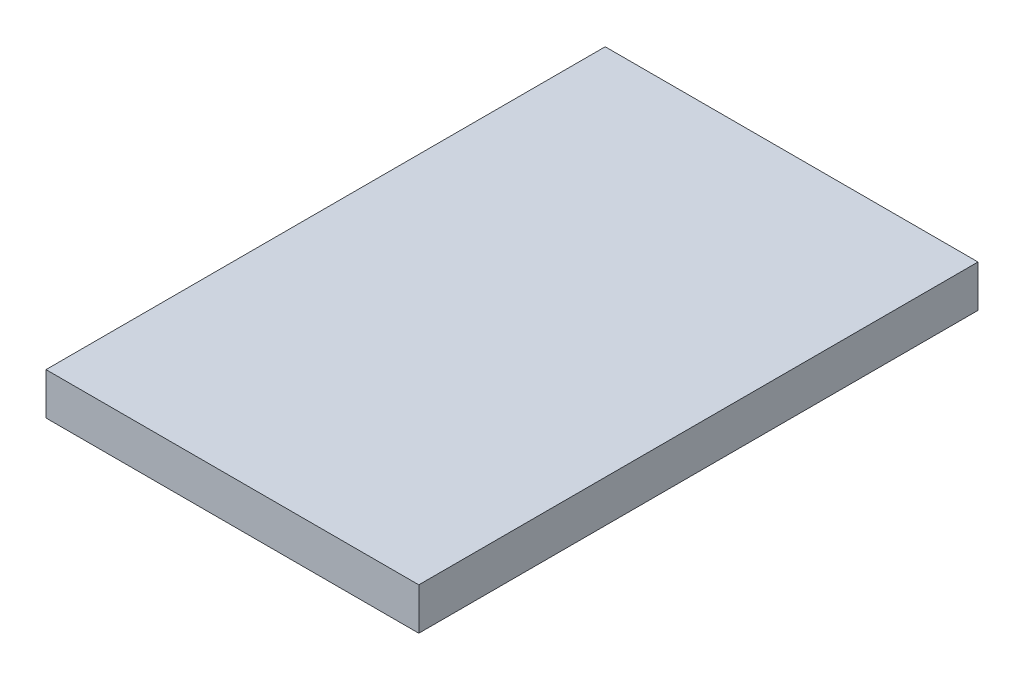
ISO-10303-21;
HEADER;
FILE_DESCRIPTION(('STEP AP214'),'2;1');
FILE_NAME('part.step','',(''),(''),'','','');
FILE_SCHEMA(('AUTOMOTIVE_DESIGN { 1 0 10303 214 1 1 1 1 }'));
ENDSEC;
DATA;
#1=APPLICATION_CONTEXT('core data for automotive mechanical design processes');
#2=APPLICATION_PROTOCOL_DEFINITION('international standard','automotive_design',2000,#1);
#3=PRODUCT_CONTEXT('',#1,'mechanical');
#4=PRODUCT('Part','Part','',(#3));
#5=PRODUCT_RELATED_PRODUCT_CATEGORY('part','',(#4));
#6=PRODUCT_DEFINITION_FORMATION('','',#4);
#7=PRODUCT_DEFINITION_CONTEXT('part definition',#1,'design');
#8=PRODUCT_DEFINITION('design','',#6,#7);
#9=PRODUCT_DEFINITION_SHAPE('','',#8);
#10=(LENGTH_UNIT() NAMED_UNIT(*) SI_UNIT(.MILLI.,.METRE.));
#11=(NAMED_UNIT(*) PLANE_ANGLE_UNIT() SI_UNIT($,.RADIAN.));
#12=(NAMED_UNIT(*) SI_UNIT($,.STERADIAN.) SOLID_ANGLE_UNIT());
#13=UNCERTAINTY_MEASURE_WITH_UNIT(LENGTH_MEASURE(1.E-05),#10,'distance_accuracy_value','');
#14=(GEOMETRIC_REPRESENTATION_CONTEXT(3) GLOBAL_UNCERTAINTY_ASSIGNED_CONTEXT((#13)) GLOBAL_UNIT_ASSIGNED_CONTEXT((#10,
#11,#12)) REPRESENTATION_CONTEXT('',''));
#15=CARTESIAN_POINT('',(0.,0.,0.));
#16=DIRECTION('',(0.,0.,1.));
#17=DIRECTION('',(1.,0.,0.));
#18=AXIS2_PLACEMENT_3D('',#15,#16,#17);
#19=CARTESIAN_POINT('',(3.6712,2.9756,3.4242));
#20=DIRECTION('',(1.,0.,0.));
#21=DIRECTION('',(0.,-1.,0.));
#22=AXIS2_PLACEMENT_3D('',#19,#20,#21);
#23=PLANE('',#22);
#24=DIRECTION('',(0.,0.,1.));
#25=VECTOR('',#24,1.);
#26=CARTESIAN_POINT('',(3.6712,2.9306,3.4242));
#27=LINE('',#26,#25);
#28=CARTESIAN_POINT('',(3.6712,2.9306,2.8242));
#29=VERTEX_POINT('',#28);
#30=CARTESIAN_POINT('',(3.6712,2.9306,3.4242));
#31=VERTEX_POINT('',#30);
#32=EDGE_CURVE('E11',#29,#31,#27,.T.);
#33=ORIENTED_EDGE('',*,*,#32,.T.);
#34=DIRECTION('',(0.,-1.,0.));
#35=VECTOR('',#34,1.);
#36=CARTESIAN_POINT('',(3.6712,2.9756,3.4242));
#37=LINE('',#36,#35);
#38=CARTESIAN_POINT('',(3.6712,2.9756,3.4242));
#39=VERTEX_POINT('',#38);
#40=EDGE_CURVE('E24',#39,#31,#37,.T.);
#41=ORIENTED_EDGE('',*,*,#40,.F.);
#42=DIRECTION('',(0.,0.,1.));
#43=VECTOR('',#42,1.);
#44=CARTESIAN_POINT('',(3.6712,2.9756,3.4242));
#45=LINE('',#44,#43);
#46=CARTESIAN_POINT('',(3.6712,2.9756,2.8242));
#47=VERTEX_POINT('',#46);
#48=EDGE_CURVE('E88',#47,#39,#45,.T.);
#49=ORIENTED_EDGE('',*,*,#48,.F.);
#50=DIRECTION('',(0.,-1.,0.));
#51=VECTOR('',#50,1.);
#52=CARTESIAN_POINT('',(3.6712,2.9756,2.8242));
#53=LINE('',#52,#51);
#54=EDGE_CURVE('E77',#47,#29,#53,.T.);
#55=ORIENTED_EDGE('',*,*,#54,.T.);
#56=EDGE_LOOP('',(#33,#41,#49,#55));
#57=FACE_BOUND('',#56,.T.);
#58=ADVANCED_FACE('F17',(#57),#23,.F.);
#59=CARTESIAN_POINT('',(4.0712,2.9756,3.4242));
#60=DIRECTION('',(0.,0.,-1.));
#61=DIRECTION('',(0.,1.,0.));
#62=AXIS2_PLACEMENT_3D('',#59,#60,#61);
#63=PLANE('',#62);
#64=DIRECTION('',(1.,0.,0.));
#65=VECTOR('',#64,1.);
#66=CARTESIAN_POINT('',(4.0712,2.9306,3.4242));
#67=LINE('',#66,#65);
#68=CARTESIAN_POINT('',(4.0712,2.9306,3.4242));
#69=VERTEX_POINT('',#68);
#70=EDGE_CURVE('E85',#31,#69,#67,.T.);
#71=ORIENTED_EDGE('',*,*,#70,.T.);
#72=DIRECTION('',(0.,-1.,0.));
#73=VECTOR('',#72,1.);
#74=CARTESIAN_POINT('',(4.0712,2.9756,3.4242));
#75=LINE('',#74,#73);
#76=CARTESIAN_POINT('',(4.0712,2.9756,3.4242));
#77=VERTEX_POINT('',#76);
#78=EDGE_CURVE('E83',#77,#69,#75,.T.);
#79=ORIENTED_EDGE('',*,*,#78,.F.);
#80=DIRECTION('',(1.,0.,0.));
#81=VECTOR('',#80,1.);
#82=CARTESIAN_POINT('',(4.0712,2.9756,3.4242));
#83=LINE('',#82,#81);
#84=EDGE_CURVE('E72',#39,#77,#83,.T.);
#85=ORIENTED_EDGE('',*,*,#84,.F.);
#86=ORIENTED_EDGE('',*,*,#40,.T.);
#87=EDGE_LOOP('',(#71,#79,#85,#86));
#88=FACE_BOUND('',#87,.T.);
#89=ADVANCED_FACE('F90',(#88),#63,.F.);
#90=CARTESIAN_POINT('',(4.0712,2.9756,2.8242));
#91=DIRECTION('',(-1.,0.,0.));
#92=DIRECTION('',(0.,1.,0.));
#93=AXIS2_PLACEMENT_3D('',#90,#91,#92);
#94=PLANE('',#93);
#95=DIRECTION('',(0.,0.,-1.));
#96=VECTOR('',#95,1.);
#97=CARTESIAN_POINT('',(4.0712,2.9306,2.8242));
#98=LINE('',#97,#96);
#99=CARTESIAN_POINT('',(4.0712,2.9306,2.8242));
#100=VERTEX_POINT('',#99);
#101=EDGE_CURVE('E60',#69,#100,#98,.T.);
#102=ORIENTED_EDGE('',*,*,#101,.T.);
#103=DIRECTION('',(0.,-1.,0.));
#104=VECTOR('',#103,1.);
#105=CARTESIAN_POINT('',(4.0712,2.9756,2.8242));
#106=LINE('',#105,#104);
#107=CARTESIAN_POINT('',(4.0712,2.9756,2.8242));
#108=VERTEX_POINT('',#107);
#109=EDGE_CURVE('E54',#108,#100,#106,.T.);
#110=ORIENTED_EDGE('',*,*,#109,.F.);
#111=DIRECTION('',(0.,0.,-1.));
#112=VECTOR('',#111,1.);
#113=CARTESIAN_POINT('',(4.0712,2.9756,2.8242));
#114=LINE('',#113,#112);
#115=EDGE_CURVE('E58',#77,#108,#114,.T.);
#116=ORIENTED_EDGE('',*,*,#115,.F.);
#117=ORIENTED_EDGE('',*,*,#78,.T.);
#118=EDGE_LOOP('',(#102,#110,#116,#117));
#119=FACE_BOUND('',#118,.T.);
#120=ADVANCED_FACE('F56',(#119),#94,.F.);
#121=CARTESIAN_POINT('',(3.6712,2.9756,2.8242));
#122=DIRECTION('',(0.,0.,1.));
#123=DIRECTION('',(0.,-1.,0.));
#124=AXIS2_PLACEMENT_3D('',#121,#122,#123);
#125=PLANE('',#124);
#126=DIRECTION('',(-1.,0.,0.));
#127=VECTOR('',#126,1.);
#128=CARTESIAN_POINT('',(3.6712,2.9306,2.8242));
#129=LINE('',#128,#127);
#130=EDGE_CURVE('E73',#100,#29,#129,.T.);
#131=ORIENTED_EDGE('',*,*,#130,.T.);
#132=ORIENTED_EDGE('',*,*,#54,.F.);
#133=DIRECTION('',(-1.,0.,0.));
#134=VECTOR('',#133,1.);
#135=CARTESIAN_POINT('',(3.6712,2.9756,2.8242));
#136=LINE('',#135,#134);
#137=EDGE_CURVE('E70',#108,#47,#136,.T.);
#138=ORIENTED_EDGE('',*,*,#137,.F.);
#139=ORIENTED_EDGE('',*,*,#109,.T.);
#140=EDGE_LOOP('',(#131,#132,#138,#139));
#141=FACE_BOUND('',#140,.T.);
#142=ADVANCED_FACE('F76',(#141),#125,.F.);
#143=CARTESIAN_POINT('',(0.,2.9756,0.));
#144=DIRECTION('',(0.,-1.,0.));
#145=DIRECTION('',(-1.,0.,0.));
#146=AXIS2_PLACEMENT_3D('',#143,#144,#145);
#147=PLANE('',#146);
#148=ORIENTED_EDGE('',*,*,#48,.T.);
#149=ORIENTED_EDGE('',*,*,#84,.T.);
#150=ORIENTED_EDGE('',*,*,#115,.T.);
#151=ORIENTED_EDGE('',*,*,#137,.T.);
#152=EDGE_LOOP('',(#148,#149,#150,#151));
#153=FACE_BOUND('',#152,.T.);
#154=ADVANCED_FACE('F69',(#153),#147,.F.);
#155=CARTESIAN_POINT('',(0.,2.9306,0.));
#156=DIRECTION('',(0.,-1.,0.));
#157=DIRECTION('',(-1.,0.,0.));
#158=AXIS2_PLACEMENT_3D('',#155,#156,#157);
#159=PLANE('',#158);
#160=ORIENTED_EDGE('',*,*,#32,.F.);
#161=ORIENTED_EDGE('',*,*,#130,.F.);
#162=ORIENTED_EDGE('',*,*,#101,.F.);
#163=ORIENTED_EDGE('',*,*,#70,.F.);
#164=EDGE_LOOP('',(#160,#161,#162,#163));
#165=FACE_BOUND('',#164,.T.);
#166=ADVANCED_FACE('F91',(#165),#159,.T.);
#167=CLOSED_SHELL('',(#58,#89,#120,#142,#154,#166));
#168=MANIFOLD_SOLID_BREP('B1',#167);
#169=ADVANCED_BREP_SHAPE_REPRESENTATION('',(#18,#168),#14);
#170=SHAPE_DEFINITION_REPRESENTATION(#9,#169);
ENDSEC;
END-ISO-10303-21;
